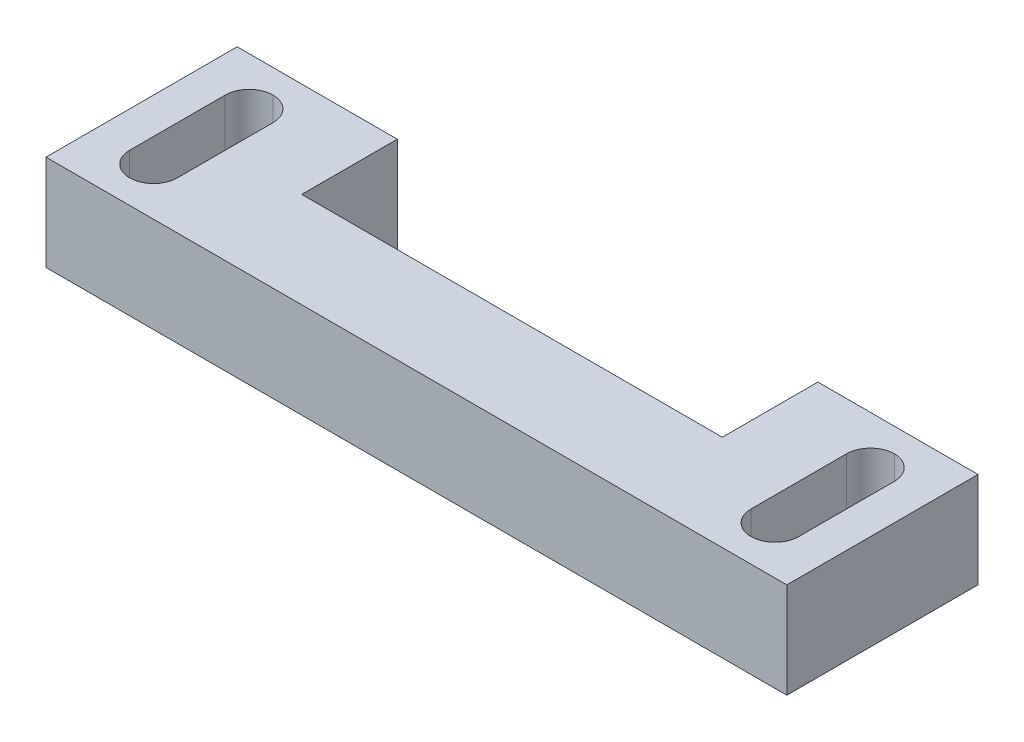
ISO-10303-21;
HEADER;
FILE_DESCRIPTION(('STEP AP214'),'2;1');
FILE_NAME('part.step','',(''),(''),'','','');
FILE_SCHEMA(('AUTOMOTIVE_DESIGN { 1 0 10303 214 1 1 1 1 }'));
ENDSEC;
DATA;
#1=APPLICATION_CONTEXT('core data for automotive mechanical design processes');
#2=APPLICATION_PROTOCOL_DEFINITION('international standard','automotive_design',2000,#1);
#3=PRODUCT_CONTEXT('',#1,'mechanical');
#4=PRODUCT('Part','Part','',(#3));
#5=PRODUCT_RELATED_PRODUCT_CATEGORY('part','',(#4));
#6=PRODUCT_DEFINITION_FORMATION('','',#4);
#7=PRODUCT_DEFINITION_CONTEXT('part definition',#1,'design');
#8=PRODUCT_DEFINITION('design','',#6,#7);
#9=PRODUCT_DEFINITION_SHAPE('','',#8);
#10=(LENGTH_UNIT() NAMED_UNIT(*) SI_UNIT(.MILLI.,.METRE.));
#11=(NAMED_UNIT(*) PLANE_ANGLE_UNIT() SI_UNIT($,.RADIAN.));
#12=(NAMED_UNIT(*) SI_UNIT($,.STERADIAN.) SOLID_ANGLE_UNIT());
#13=UNCERTAINTY_MEASURE_WITH_UNIT(LENGTH_MEASURE(1.E-05),#10,'distance_accuracy_value','');
#14=(GEOMETRIC_REPRESENTATION_CONTEXT(3) GLOBAL_UNCERTAINTY_ASSIGNED_CONTEXT((#13)) GLOBAL_UNIT_ASSIGNED_CONTEXT((#10,
#11,#12)) REPRESENTATION_CONTEXT('',''));
#15=CARTESIAN_POINT('',(0.,0.,0.));
#16=DIRECTION('',(0.,0.,1.));
#17=DIRECTION('',(1.,0.,0.));
#18=AXIS2_PLACEMENT_3D('',#15,#16,#17);
#19=CARTESIAN_POINT('',(0.,0.,-12.7));
#20=DIRECTION('',(0.,0.,1.));
#21=DIRECTION('',(1.,0.,0.));
#22=AXIS2_PLACEMENT_3D('',#19,#20,#21);
#23=PLANE('',#22);
#24=DIRECTION('',(-1.,0.,0.));
#25=VECTOR('',#24,1.);
#26=CARTESIAN_POINT('',(-49.2125,6.35,-12.7));
#27=LINE('',#26,#25);
#28=CARTESIAN_POINT('',(-27.94,6.35,-12.7));
#29=VERTEX_POINT('',#28);
#30=CARTESIAN_POINT('',(-49.2125,6.35,-12.7));
#31=VERTEX_POINT('',#30);
#32=EDGE_CURVE('E273',#29,#31,#27,.T.);
#33=ORIENTED_EDGE('',*,*,#32,.F.);
#34=DIRECTION('',(0.,1.,0.));
#35=VECTOR('',#34,1.);
#36=CARTESIAN_POINT('',(-27.94,-6.351,-12.7));
#37=LINE('',#36,#35);
#38=CARTESIAN_POINT('',(-27.94,-6.35,-12.7));
#39=VERTEX_POINT('',#38);
#40=EDGE_CURVE('E193',#39,#29,#37,.T.);
#41=ORIENTED_EDGE('',*,*,#40,.F.);
#42=DIRECTION('',(1.,0.,0.));
#43=VECTOR('',#42,1.);
#44=CARTESIAN_POINT('',(-49.2125,-6.35,-12.7));
#45=LINE('',#44,#43);
#46=CARTESIAN_POINT('',(-49.2125,-6.35,-12.7));
#47=VERTEX_POINT('',#46);
#48=EDGE_CURVE('E199',#47,#39,#45,.T.);
#49=ORIENTED_EDGE('',*,*,#48,.F.);
#50=DIRECTION('',(0.,-1.,0.));
#51=VECTOR('',#50,1.);
#52=CARTESIAN_POINT('',(-49.2125,6.35,-12.7));
#53=LINE('',#52,#51);
#54=EDGE_CURVE('E248',#31,#47,#53,.T.);
#55=ORIENTED_EDGE('',*,*,#54,.F.);
#56=EDGE_LOOP('',(#33,#41,#49,#55));
#57=FACE_BOUND('',#56,.T.);
#58=ADVANCED_FACE('F36',(#57),#23,.F.);
#59=CARTESIAN_POINT('',(41.275,-6.351,6.35));
#60=DIRECTION('',(0.,1.,0.));
#61=DIRECTION('',(0.,0.,1.));
#62=AXIS2_PLACEMENT_3D('',#59,#60,#61);
#63=CYLINDRICAL_SURFACE('',#62,3.175);
#64=DIRECTION('',(0.,-1.,0.));
#65=VECTOR('',#64,1.);
#66=CARTESIAN_POINT('',(38.1,-6.351,6.35));
#67=LINE('',#66,#65);
#68=CARTESIAN_POINT('',(38.1,6.35,6.35));
#69=VERTEX_POINT('',#68);
#70=CARTESIAN_POINT('',(38.1,-6.35,6.35));
#71=VERTEX_POINT('',#70);
#72=EDGE_CURVE('E382',#69,#71,#67,.T.);
#73=ORIENTED_EDGE('',*,*,#72,.F.);
#74=CARTESIAN_POINT('',(41.275,6.35,6.35));
#75=DIRECTION('',(0.,-1.,0.));
#76=DIRECTION('',(0.,0.,-1.));
#77=AXIS2_PLACEMENT_3D('',#74,#75,#76);
#78=CIRCLE('',#77,3.175);
#79=CARTESIAN_POINT('',(41.275,6.35,9.525));
#80=VERTEX_POINT('',#79);
#81=EDGE_CURVE('E45',#69,#80,#78,.F.);
#82=ORIENTED_EDGE('',*,*,#81,.T.);
#83=DIRECTION('',(0.,1.,0.));
#84=VECTOR('',#83,1.);
#85=CARTESIAN_POINT('',(41.275,-6.351,9.525));
#86=LINE('',#85,#84);
#87=CARTESIAN_POINT('',(41.275,-6.35,9.525));
#88=VERTEX_POINT('',#87);
#89=EDGE_CURVE('E371',#80,#88,#86,.F.);
#90=ORIENTED_EDGE('',*,*,#89,.T.);
#91=CARTESIAN_POINT('',(41.275,-6.35,6.35));
#92=DIRECTION('',(0.,1.,0.));
#93=DIRECTION('',(0.,0.,1.));
#94=AXIS2_PLACEMENT_3D('',#91,#92,#93);
#95=CIRCLE('',#94,3.175);
#96=EDGE_CURVE('E11',#88,#71,#95,.F.);
#97=ORIENTED_EDGE('',*,*,#96,.T.);
#98=EDGE_LOOP('',(#73,#82,#90,#97));
#99=FACE_BOUND('',#98,.T.);
#100=ADVANCED_FACE('F38',(#99),#63,.F.);
#101=CARTESIAN_POINT('',(41.275,-6.351,6.35));
#102=DIRECTION('',(0.,-1.,0.));
#103=DIRECTION('',(0.,0.,-1.));
#104=AXIS2_PLACEMENT_3D('',#101,#102,#103);
#105=CYLINDRICAL_SURFACE('',#104,3.175);
#106=DIRECTION('',(0.,1.,0.));
#107=VECTOR('',#106,1.);
#108=CARTESIAN_POINT('',(44.45,-6.351,6.35));
#109=LINE('',#108,#107);
#110=CARTESIAN_POINT('',(44.45,-6.35,6.35));
#111=VERTEX_POINT('',#110);
#112=CARTESIAN_POINT('',(44.45,6.35,6.35));
#113=VERTEX_POINT('',#112);
#114=EDGE_CURVE('E368',#111,#113,#109,.T.);
#115=ORIENTED_EDGE('',*,*,#114,.F.);
#116=CARTESIAN_POINT('',(41.275,-6.35,6.35));
#117=DIRECTION('',(0.,1.,0.));
#118=DIRECTION('',(0.,0.,1.));
#119=AXIS2_PLACEMENT_3D('',#116,#117,#118);
#120=CIRCLE('',#119,3.175);
#121=EDGE_CURVE('E375',#111,#88,#120,.F.);
#122=ORIENTED_EDGE('',*,*,#121,.T.);
#123=ORIENTED_EDGE('',*,*,#89,.F.);
#124=CARTESIAN_POINT('',(41.275,6.35,6.35));
#125=DIRECTION('',(0.,-1.,0.));
#126=DIRECTION('',(0.,0.,-1.));
#127=AXIS2_PLACEMENT_3D('',#124,#125,#126);
#128=CIRCLE('',#127,3.175);
#129=EDGE_CURVE('E379',#80,#113,#128,.F.);
#130=ORIENTED_EDGE('',*,*,#129,.T.);
#131=EDGE_LOOP('',(#115,#122,#123,#130));
#132=FACE_BOUND('',#131,.T.);
#133=ADVANCED_FACE('F394',(#132),#105,.F.);
#134=CARTESIAN_POINT('',(41.275,-6.351,-6.35));
#135=DIRECTION('',(0.,1.,0.));
#136=DIRECTION('',(0.,0.,1.));
#137=AXIS2_PLACEMENT_3D('',#134,#135,#136);
#138=CYLINDRICAL_SURFACE('',#137,3.175);
#139=DIRECTION('',(0.,-1.,0.));
#140=VECTOR('',#139,1.);
#141=CARTESIAN_POINT('',(38.1,-6.351,-6.35));
#142=LINE('',#141,#140);
#143=CARTESIAN_POINT('',(38.1,-6.35,-6.35));
#144=VERTEX_POINT('',#143);
#145=CARTESIAN_POINT('',(38.1,6.35,-6.35));
#146=VERTEX_POINT('',#145);
#147=EDGE_CURVE('E357',#144,#146,#142,.F.);
#148=ORIENTED_EDGE('',*,*,#147,.F.);
#149=CARTESIAN_POINT('',(41.275,-6.35,-6.35));
#150=DIRECTION('',(0.,1.,0.));
#151=DIRECTION('',(0.,0.,1.));
#152=AXIS2_PLACEMENT_3D('',#149,#150,#151);
#153=CIRCLE('',#152,3.175);
#154=CARTESIAN_POINT('',(41.275,-6.35,-9.525));
#155=VERTEX_POINT('',#154);
#156=EDGE_CURVE('E365',#144,#155,#153,.F.);
#157=ORIENTED_EDGE('',*,*,#156,.T.);
#158=DIRECTION('',(0.,-1.,0.));
#159=VECTOR('',#158,1.);
#160=CARTESIAN_POINT('',(41.275,-6.351,-9.525));
#161=LINE('',#160,#159);
#162=CARTESIAN_POINT('',(41.275,6.35,-9.525));
#163=VERTEX_POINT('',#162);
#164=EDGE_CURVE('E345',#155,#163,#161,.F.);
#165=ORIENTED_EDGE('',*,*,#164,.T.);
#166=CARTESIAN_POINT('',(41.275,6.35,-6.35));
#167=DIRECTION('',(0.,-1.,0.));
#168=DIRECTION('',(0.,0.,-1.));
#169=AXIS2_PLACEMENT_3D('',#166,#167,#168);
#170=CIRCLE('',#169,3.175);
#171=EDGE_CURVE('E361',#163,#146,#170,.F.);
#172=ORIENTED_EDGE('',*,*,#171,.T.);
#173=EDGE_LOOP('',(#148,#157,#165,#172));
#174=FACE_BOUND('',#173,.T.);
#175=ADVANCED_FACE('F403',(#174),#138,.F.);
#176=CARTESIAN_POINT('',(41.275,-6.351,-6.35));
#177=DIRECTION('',(0.,1.,0.));
#178=DIRECTION('',(0.,0.,1.));
#179=AXIS2_PLACEMENT_3D('',#176,#177,#178);
#180=CYLINDRICAL_SURFACE('',#179,3.175);
#181=DIRECTION('',(0.,-1.,0.));
#182=VECTOR('',#181,1.);
#183=CARTESIAN_POINT('',(44.45,-6.351,-6.35));
#184=LINE('',#183,#182);
#185=CARTESIAN_POINT('',(44.45,6.35,-6.35));
#186=VERTEX_POINT('',#185);
#187=CARTESIAN_POINT('',(44.45,-6.35,-6.35));
#188=VERTEX_POINT('',#187);
#189=EDGE_CURVE('E341',#186,#188,#184,.T.);
#190=ORIENTED_EDGE('',*,*,#189,.F.);
#191=CARTESIAN_POINT('',(41.275,6.35,-6.35));
#192=DIRECTION('',(0.,-1.,0.));
#193=DIRECTION('',(0.,0.,-1.));
#194=AXIS2_PLACEMENT_3D('',#191,#192,#193);
#195=CIRCLE('',#194,3.175);
#196=EDGE_CURVE('E349',#186,#163,#195,.F.);
#197=ORIENTED_EDGE('',*,*,#196,.T.);
#198=ORIENTED_EDGE('',*,*,#164,.F.);
#199=CARTESIAN_POINT('',(41.275,-6.35,-6.35));
#200=DIRECTION('',(0.,1.,0.));
#201=DIRECTION('',(0.,0.,1.));
#202=AXIS2_PLACEMENT_3D('',#199,#200,#201);
#203=CIRCLE('',#202,3.175);
#204=EDGE_CURVE('E353',#155,#188,#203,.F.);
#205=ORIENTED_EDGE('',*,*,#204,.T.);
#206=EDGE_LOOP('',(#190,#197,#198,#205));
#207=FACE_BOUND('',#206,.T.);
#208=ADVANCED_FACE('F407',(#207),#180,.F.);
#209=CARTESIAN_POINT('',(-49.2125,-6.35,12.7));
#210=DIRECTION('',(0.,1.,0.));
#211=DIRECTION('',(0.,0.,1.));
#212=AXIS2_PLACEMENT_3D('',#209,#210,#211);
#213=PLANE('',#212);
#214=ORIENTED_EDGE('',*,*,#48,.T.);
#215=DIRECTION('',(0.,0.,-1.));
#216=VECTOR('',#215,1.);
#217=CARTESIAN_POINT('',(-27.94,-6.35,-12.7));
#218=LINE('',#217,#216);
#219=CARTESIAN_POINT('',(-27.94,-6.35,0.));
#220=VERTEX_POINT('',#219);
#221=EDGE_CURVE('E175',#220,#39,#218,.T.);
#222=ORIENTED_EDGE('',*,*,#221,.F.);
#223=DIRECTION('',(-1.,0.,0.));
#224=VECTOR('',#223,1.);
#225=CARTESIAN_POINT('',(-27.94,-6.35,0.));
#226=LINE('',#225,#224);
#227=CARTESIAN_POINT('',(27.94,-6.35,0.));
#228=VERTEX_POINT('',#227);
#229=EDGE_CURVE('E186',#228,#220,#226,.T.);
#230=ORIENTED_EDGE('',*,*,#229,.F.);
#231=DIRECTION('',(0.,0.,1.));
#232=VECTOR('',#231,1.);
#233=CARTESIAN_POINT('',(27.94,-6.35,-12.7));
#234=LINE('',#233,#232);
#235=CARTESIAN_POINT('',(27.94,-6.35,-12.7));
#236=VERTEX_POINT('',#235);
#237=EDGE_CURVE('E201',#236,#228,#234,.T.);
#238=ORIENTED_EDGE('',*,*,#237,.F.);
#239=CARTESIAN_POINT('',(49.2125,-6.35,-12.7));
#240=VERTEX_POINT('',#239);
#241=EDGE_CURVE('E267',#236,#240,#45,.T.);
#242=ORIENTED_EDGE('',*,*,#241,.T.);
#243=DIRECTION('',(0.,0.,-1.));
#244=VECTOR('',#243,1.);
#245=CARTESIAN_POINT('',(49.2125,-6.35,12.7));
#246=LINE('',#245,#244);
#247=CARTESIAN_POINT('',(49.2125,-6.35,12.7));
#248=VERTEX_POINT('',#247);
#249=EDGE_CURVE('E284',#248,#240,#246,.T.);
#250=ORIENTED_EDGE('',*,*,#249,.F.);
#251=DIRECTION('',(1.,0.,0.));
#252=VECTOR('',#251,1.);
#253=CARTESIAN_POINT('',(-49.2125,-6.35,12.7));
#254=LINE('',#253,#252);
#255=CARTESIAN_POINT('',(-49.2125,-6.35,12.7));
#256=VERTEX_POINT('',#255);
#257=EDGE_CURVE('E253',#256,#248,#254,.T.);
#258=ORIENTED_EDGE('',*,*,#257,.F.);
#259=DIRECTION('',(0.,0.,-1.));
#260=VECTOR('',#259,1.);
#261=CARTESIAN_POINT('',(-49.2125,-6.35,12.7));
#262=LINE('',#261,#260);
#263=EDGE_CURVE('E288',#256,#47,#262,.T.);
#264=ORIENTED_EDGE('',*,*,#263,.T.);
#265=EDGE_LOOP('',(#214,#222,#230,#238,#242,#250,#258,#264));
#266=FACE_BOUND('',#265,.T.);
#267=ORIENTED_EDGE('',*,*,#96,.F.);
#268=ORIENTED_EDGE('',*,*,#121,.F.);
#269=DIRECTION('',(0.,0.,-1.));
#270=VECTOR('',#269,1.);
#271=CARTESIAN_POINT('',(44.45,-6.35,-9.525));
#272=LINE('',#271,#270);
#273=EDGE_CURVE('E225',#111,#188,#272,.T.);
#274=ORIENTED_EDGE('',*,*,#273,.T.);
#275=ORIENTED_EDGE('',*,*,#204,.F.);
#276=ORIENTED_EDGE('',*,*,#156,.F.);
#277=DIRECTION('',(0.,0.,1.));
#278=VECTOR('',#277,1.);
#279=CARTESIAN_POINT('',(38.1,-6.35,-9.525));
#280=LINE('',#279,#278);
#281=EDGE_CURVE('E192',#144,#71,#280,.T.);
#282=ORIENTED_EDGE('',*,*,#281,.T.);
#283=EDGE_LOOP('',(#267,#268,#274,#275,#276,#282));
#284=FACE_BOUND('',#283,.T.);
#285=CARTESIAN_POINT('',(-41.275,-6.35,-6.35));
#286=DIRECTION('',(0.,1.,0.));
#287=DIRECTION('',(0.,0.,1.));
#288=AXIS2_PLACEMENT_3D('',#285,#286,#287);
#289=CIRCLE('',#288,3.175);
#290=CARTESIAN_POINT('',(-41.275,-6.35,-9.525));
#291=VERTEX_POINT('',#290);
#292=CARTESIAN_POINT('',(-38.1,-6.35,-6.35));
#293=VERTEX_POINT('',#292);
#294=EDGE_CURVE('E310',#291,#293,#289,.F.);
#295=ORIENTED_EDGE('',*,*,#294,.F.);
#296=CARTESIAN_POINT('',(-41.275,-6.35,-6.35));
#297=DIRECTION('',(0.,1.,0.));
#298=DIRECTION('',(0.,0.,1.));
#299=AXIS2_PLACEMENT_3D('',#296,#297,#298);
#300=CIRCLE('',#299,3.175);
#301=CARTESIAN_POINT('',(-44.45,-6.35,-6.35));
#302=VERTEX_POINT('',#301);
#303=EDGE_CURVE('E299',#302,#291,#300,.F.);
#304=ORIENTED_EDGE('',*,*,#303,.F.);
#305=DIRECTION('',(0.,0.,-1.));
#306=VECTOR('',#305,1.);
#307=CARTESIAN_POINT('',(-44.45,-6.35,-9.525));
#308=LINE('',#307,#306);
#309=CARTESIAN_POINT('',(-44.45,-6.35,6.35));
#310=VERTEX_POINT('',#309);
#311=EDGE_CURVE('E238',#310,#302,#308,.T.);
#312=ORIENTED_EDGE('',*,*,#311,.F.);
#313=CARTESIAN_POINT('',(-41.275,-6.35,6.35));
#314=DIRECTION('',(0.,1.,0.));
#315=DIRECTION('',(0.,0.,1.));
#316=AXIS2_PLACEMENT_3D('',#313,#314,#315);
#317=CIRCLE('',#316,3.175);
#318=CARTESIAN_POINT('',(-41.275,-6.35,9.525));
#319=VERTEX_POINT('',#318);
#320=EDGE_CURVE('E328',#319,#310,#317,.F.);
#321=ORIENTED_EDGE('',*,*,#320,.F.);
#322=CARTESIAN_POINT('',(-41.275,-6.35,6.35));
#323=DIRECTION('',(0.,1.,0.));
#324=DIRECTION('',(0.,0.,1.));
#325=AXIS2_PLACEMENT_3D('',#322,#323,#324);
#326=CIRCLE('',#325,3.175);
#327=CARTESIAN_POINT('',(-38.1,-6.35,6.35));
#328=VERTEX_POINT('',#327);
#329=EDGE_CURVE('E335',#328,#319,#326,.F.);
#330=ORIENTED_EDGE('',*,*,#329,.F.);
#331=DIRECTION('',(0.,0.,1.));
#332=VECTOR('',#331,1.);
#333=CARTESIAN_POINT('',(-38.1,-6.35,-9.525));
#334=LINE('',#333,#332);
#335=EDGE_CURVE('E234',#293,#328,#334,.T.);
#336=ORIENTED_EDGE('',*,*,#335,.F.);
#337=EDGE_LOOP('',(#295,#304,#312,#321,#330,#336));
#338=FACE_BOUND('',#337,.T.);
#339=ADVANCED_FACE('F196',(#266,#284,#338),#213,.F.);
#340=CARTESIAN_POINT('',(-49.2125,6.35,12.7));
#341=DIRECTION('',(0.,-1.,0.));
#342=DIRECTION('',(0.,0.,-1.));
#343=AXIS2_PLACEMENT_3D('',#340,#341,#342);
#344=PLANE('',#343);
#345=ORIENTED_EDGE('',*,*,#81,.F.);
#346=DIRECTION('',(0.,0.,-1.));
#347=VECTOR('',#346,1.);
#348=CARTESIAN_POINT('',(38.1,6.35,-9.525));
#349=LINE('',#348,#347);
#350=EDGE_CURVE('E231',#69,#146,#349,.T.);
#351=ORIENTED_EDGE('',*,*,#350,.T.);
#352=ORIENTED_EDGE('',*,*,#171,.F.);
#353=ORIENTED_EDGE('',*,*,#196,.F.);
#354=DIRECTION('',(0.,0.,1.));
#355=VECTOR('',#354,1.);
#356=CARTESIAN_POINT('',(44.45,6.35,-9.525));
#357=LINE('',#356,#355);
#358=EDGE_CURVE('E227',#186,#113,#357,.T.);
#359=ORIENTED_EDGE('',*,*,#358,.T.);
#360=ORIENTED_EDGE('',*,*,#129,.F.);
#361=EDGE_LOOP('',(#345,#351,#352,#353,#359,#360));
#362=FACE_BOUND('',#361,.T.);
#363=DIRECTION('',(1.,0.,0.));
#364=VECTOR('',#363,1.);
#365=CARTESIAN_POINT('',(-27.94,6.35,0.));
#366=LINE('',#365,#364);
#367=CARTESIAN_POINT('',(-27.94,6.35,0.));
#368=VERTEX_POINT('',#367);
#369=CARTESIAN_POINT('',(27.94,6.35,0.));
#370=VERTEX_POINT('',#369);
#371=EDGE_CURVE('E206',#368,#370,#366,.T.);
#372=ORIENTED_EDGE('',*,*,#371,.F.);
#373=DIRECTION('',(0.,0.,1.));
#374=VECTOR('',#373,1.);
#375=CARTESIAN_POINT('',(-27.94,6.35,-12.7));
#376=LINE('',#375,#374);
#377=EDGE_CURVE('E178',#29,#368,#376,.T.);
#378=ORIENTED_EDGE('',*,*,#377,.F.);
#379=ORIENTED_EDGE('',*,*,#32,.T.);
#380=DIRECTION('',(0.,0.,-1.));
#381=VECTOR('',#380,1.);
#382=CARTESIAN_POINT('',(-49.2125,6.35,12.7));
#383=LINE('',#382,#381);
#384=CARTESIAN_POINT('',(-49.2125,6.35,12.7));
#385=VERTEX_POINT('',#384);
#386=EDGE_CURVE('E263',#385,#31,#383,.T.);
#387=ORIENTED_EDGE('',*,*,#386,.F.);
#388=DIRECTION('',(-1.,0.,0.));
#389=VECTOR('',#388,1.);
#390=CARTESIAN_POINT('',(-49.2125,6.35,12.7));
#391=LINE('',#390,#389);
#392=CARTESIAN_POINT('',(49.2125,6.35,12.7));
#393=VERTEX_POINT('',#392);
#394=EDGE_CURVE('E260',#393,#385,#391,.T.);
#395=ORIENTED_EDGE('',*,*,#394,.F.);
#396=DIRECTION('',(0.,0.,-1.));
#397=VECTOR('',#396,1.);
#398=CARTESIAN_POINT('',(49.2125,6.35,12.7));
#399=LINE('',#398,#397);
#400=CARTESIAN_POINT('',(49.2125,6.35,-12.7));
#401=VERTEX_POINT('',#400);
#402=EDGE_CURVE('E280',#393,#401,#399,.T.);
#403=ORIENTED_EDGE('',*,*,#402,.T.);
#404=CARTESIAN_POINT('',(27.94,6.35,-12.7));
#405=VERTEX_POINT('',#404);
#406=EDGE_CURVE('E254',#401,#405,#27,.T.);
#407=ORIENTED_EDGE('',*,*,#406,.T.);
#408=DIRECTION('',(0.,0.,-1.));
#409=VECTOR('',#408,1.);
#410=CARTESIAN_POINT('',(27.94,6.35,-12.7));
#411=LINE('',#410,#409);
#412=EDGE_CURVE('E52',#370,#405,#411,.T.);
#413=ORIENTED_EDGE('',*,*,#412,.F.);
#414=EDGE_LOOP('',(#372,#378,#379,#387,#395,#403,#407,#413));
#415=FACE_BOUND('',#414,.T.);
#416=CARTESIAN_POINT('',(-41.275,6.35,6.35));
#417=DIRECTION('',(0.,-1.,0.));
#418=DIRECTION('',(0.,0.,-1.));
#419=AXIS2_PLACEMENT_3D('',#416,#417,#418);
#420=CIRCLE('',#419,3.175);
#421=CARTESIAN_POINT('',(-41.275,6.35,9.525));
#422=VERTEX_POINT('',#421);
#423=CARTESIAN_POINT('',(-38.1,6.35,6.35));
#424=VERTEX_POINT('',#423);
#425=EDGE_CURVE('E338',#422,#424,#420,.F.);
#426=ORIENTED_EDGE('',*,*,#425,.F.);
#427=CARTESIAN_POINT('',(-41.275,6.35,6.35));
#428=DIRECTION('',(0.,-1.,0.));
#429=DIRECTION('',(0.,0.,-1.));
#430=AXIS2_PLACEMENT_3D('',#427,#428,#429);
#431=CIRCLE('',#430,3.175);
#432=CARTESIAN_POINT('',(-44.45,6.35,6.35));
#433=VERTEX_POINT('',#432);
#434=EDGE_CURVE('E324',#433,#422,#431,.F.);
#435=ORIENTED_EDGE('',*,*,#434,.F.);
#436=DIRECTION('',(0.,0.,1.));
#437=VECTOR('',#436,1.);
#438=CARTESIAN_POINT('',(-44.45,6.35,-9.525));
#439=LINE('',#438,#437);
#440=CARTESIAN_POINT('',(-44.45,6.35,-6.35));
#441=VERTEX_POINT('',#440);
#442=EDGE_CURVE('E241',#441,#433,#439,.T.);
#443=ORIENTED_EDGE('',*,*,#442,.F.);
#444=CARTESIAN_POINT('',(-41.275,6.35,-6.35));
#445=DIRECTION('',(0.,-1.,0.));
#446=DIRECTION('',(0.,0.,-1.));
#447=AXIS2_PLACEMENT_3D('',#444,#445,#446);
#448=CIRCLE('',#447,3.175);
#449=CARTESIAN_POINT('',(-41.275,6.35,-9.525));
#450=VERTEX_POINT('',#449);
#451=EDGE_CURVE('E303',#450,#441,#448,.F.);
#452=ORIENTED_EDGE('',*,*,#451,.F.);
#453=CARTESIAN_POINT('',(-41.275,6.35,-6.35));
#454=DIRECTION('',(0.,-1.,0.));
#455=DIRECTION('',(0.,0.,-1.));
#456=AXIS2_PLACEMENT_3D('',#453,#454,#455);
#457=CIRCLE('',#456,3.175);
#458=CARTESIAN_POINT('',(-38.1,6.35,-6.35));
#459=VERTEX_POINT('',#458);
#460=EDGE_CURVE('E313',#459,#450,#457,.F.);
#461=ORIENTED_EDGE('',*,*,#460,.F.);
#462=DIRECTION('',(0.,0.,-1.));
#463=VECTOR('',#462,1.);
#464=CARTESIAN_POINT('',(-38.1,6.35,-9.525));
#465=LINE('',#464,#463);
#466=EDGE_CURVE('E245',#424,#459,#465,.T.);
#467=ORIENTED_EDGE('',*,*,#466,.F.);
#468=EDGE_LOOP('',(#426,#435,#443,#452,#461,#467));
#469=FACE_BOUND('',#468,.T.);
#470=ADVANCED_FACE('F389',(#362,#415,#469),#344,.F.);
#471=CARTESIAN_POINT('',(-41.275,-6.351,6.35));
#472=DIRECTION('',(0.,-1.,0.));
#473=DIRECTION('',(0.,0.,-1.));
#474=AXIS2_PLACEMENT_3D('',#471,#472,#473);
#475=CYLINDRICAL_SURFACE('',#474,3.175);
#476=DIRECTION('',(0.,1.,0.));
#477=VECTOR('',#476,1.);
#478=CARTESIAN_POINT('',(-38.1,-6.351,6.35));
#479=LINE('',#478,#477);
#480=EDGE_CURVE('E331',#328,#424,#479,.T.);
#481=ORIENTED_EDGE('',*,*,#480,.F.);
#482=ORIENTED_EDGE('',*,*,#329,.T.);
#483=DIRECTION('',(0.,-1.,0.));
#484=VECTOR('',#483,1.);
#485=CARTESIAN_POINT('',(-41.275,-6.351,9.525));
#486=LINE('',#485,#484);
#487=EDGE_CURVE('E320',#319,#422,#486,.F.);
#488=ORIENTED_EDGE('',*,*,#487,.T.);
#489=ORIENTED_EDGE('',*,*,#425,.T.);
#490=EDGE_LOOP('',(#481,#482,#488,#489));
#491=FACE_BOUND('',#490,.T.);
#492=ADVANCED_FACE('F460',(#491),#475,.F.);
#493=CARTESIAN_POINT('',(-41.275,-6.351,6.35));
#494=DIRECTION('',(0.,1.,0.));
#495=DIRECTION('',(0.,0.,1.));
#496=AXIS2_PLACEMENT_3D('',#493,#494,#495);
#497=CYLINDRICAL_SURFACE('',#496,3.175);
#498=DIRECTION('',(0.,-1.,0.));
#499=VECTOR('',#498,1.);
#500=CARTESIAN_POINT('',(-44.45,-6.351,6.35));
#501=LINE('',#500,#499);
#502=EDGE_CURVE('E316',#433,#310,#501,.T.);
#503=ORIENTED_EDGE('',*,*,#502,.F.);
#504=ORIENTED_EDGE('',*,*,#434,.T.);
#505=ORIENTED_EDGE('',*,*,#487,.F.);
#506=ORIENTED_EDGE('',*,*,#320,.T.);
#507=EDGE_LOOP('',(#503,#504,#505,#506));
#508=FACE_BOUND('',#507,.T.);
#509=ADVANCED_FACE('F469',(#508),#497,.F.);
#510=CARTESIAN_POINT('',(-41.275,-6.351,-6.35));
#511=DIRECTION('',(0.,-1.,0.));
#512=DIRECTION('',(0.,0.,-1.));
#513=AXIS2_PLACEMENT_3D('',#510,#511,#512);
#514=CYLINDRICAL_SURFACE('',#513,3.175);
#515=DIRECTION('',(0.,1.,0.));
#516=VECTOR('',#515,1.);
#517=CARTESIAN_POINT('',(-38.1,-6.351,-6.35));
#518=LINE('',#517,#516);
#519=EDGE_CURVE('E306',#459,#293,#518,.F.);
#520=ORIENTED_EDGE('',*,*,#519,.F.);
#521=ORIENTED_EDGE('',*,*,#460,.T.);
#522=DIRECTION('',(0.,1.,0.));
#523=VECTOR('',#522,1.);
#524=CARTESIAN_POINT('',(-41.275,-6.351,-9.525));
#525=LINE('',#524,#523);
#526=EDGE_CURVE('E295',#450,#291,#525,.F.);
#527=ORIENTED_EDGE('',*,*,#526,.T.);
#528=ORIENTED_EDGE('',*,*,#294,.T.);
#529=EDGE_LOOP('',(#520,#521,#527,#528));
#530=FACE_BOUND('',#529,.T.);
#531=ADVANCED_FACE('F481',(#530),#514,.F.);
#532=CARTESIAN_POINT('',(-41.275,-6.351,-6.35));
#533=DIRECTION('',(0.,-1.,0.));
#534=DIRECTION('',(0.,0.,-1.));
#535=AXIS2_PLACEMENT_3D('',#532,#533,#534);
#536=CYLINDRICAL_SURFACE('',#535,3.175);
#537=DIRECTION('',(0.,1.,0.));
#538=VECTOR('',#537,1.);
#539=CARTESIAN_POINT('',(-44.45,-6.351,-6.35));
#540=LINE('',#539,#538);
#541=EDGE_CURVE('E291',#302,#441,#540,.T.);
#542=ORIENTED_EDGE('',*,*,#541,.F.);
#543=ORIENTED_EDGE('',*,*,#303,.T.);
#544=ORIENTED_EDGE('',*,*,#526,.F.);
#545=ORIENTED_EDGE('',*,*,#451,.T.);
#546=EDGE_LOOP('',(#542,#543,#544,#545));
#547=FACE_BOUND('',#546,.T.);
#548=ADVANCED_FACE('F479',(#547),#536,.F.);
#549=CARTESIAN_POINT('',(-49.2125,6.35,12.7));
#550=DIRECTION('',(1.,0.,0.));
#551=DIRECTION('',(0.,0.,-1.));
#552=AXIS2_PLACEMENT_3D('',#549,#550,#551);
#553=PLANE('',#552);
#554=ORIENTED_EDGE('',*,*,#54,.T.);
#555=ORIENTED_EDGE('',*,*,#263,.F.);
#556=DIRECTION('',(0.,-1.,0.));
#557=VECTOR('',#556,1.);
#558=CARTESIAN_POINT('',(-49.2125,6.35,12.7));
#559=LINE('',#558,#557);
#560=EDGE_CURVE('E249',#385,#256,#559,.T.);
#561=ORIENTED_EDGE('',*,*,#560,.F.);
#562=ORIENTED_EDGE('',*,*,#386,.T.);
#563=EDGE_LOOP('',(#554,#555,#561,#562));
#564=FACE_BOUND('',#563,.T.);
#565=ADVANCED_FACE('F456',(#564),#553,.F.);
#566=CARTESIAN_POINT('',(49.2125,6.35,12.7));
#567=DIRECTION('',(-1.,0.,0.));
#568=DIRECTION('',(0.,0.,1.));
#569=AXIS2_PLACEMENT_3D('',#566,#567,#568);
#570=PLANE('',#569);
#571=DIRECTION('',(0.,1.,0.));
#572=VECTOR('',#571,1.);
#573=CARTESIAN_POINT('',(49.2125,6.35,-12.7));
#574=LINE('',#573,#572);
#575=EDGE_CURVE('E270',#240,#401,#574,.T.);
#576=ORIENTED_EDGE('',*,*,#575,.T.);
#577=ORIENTED_EDGE('',*,*,#402,.F.);
#578=DIRECTION('',(0.,1.,0.));
#579=VECTOR('',#578,1.);
#580=CARTESIAN_POINT('',(49.2125,6.35,12.7));
#581=LINE('',#580,#579);
#582=EDGE_CURVE('E257',#248,#393,#581,.T.);
#583=ORIENTED_EDGE('',*,*,#582,.F.);
#584=ORIENTED_EDGE('',*,*,#249,.T.);
#585=EDGE_LOOP('',(#576,#577,#583,#584));
#586=FACE_BOUND('',#585,.T.);
#587=ADVANCED_FACE('F440',(#586),#570,.F.);
#588=CARTESIAN_POINT('',(0.,0.,12.7));
#589=DIRECTION('',(0.,0.,1.));
#590=DIRECTION('',(1.,0.,0.));
#591=AXIS2_PLACEMENT_3D('',#588,#589,#590);
#592=PLANE('',#591);
#593=ORIENTED_EDGE('',*,*,#560,.T.);
#594=ORIENTED_EDGE('',*,*,#257,.T.);
#595=ORIENTED_EDGE('',*,*,#582,.T.);
#596=ORIENTED_EDGE('',*,*,#394,.T.);
#597=EDGE_LOOP('',(#593,#594,#595,#596));
#598=FACE_BOUND('',#597,.T.);
#599=ADVANCED_FACE('F432',(#598),#592,.T.);
#600=ORIENTED_EDGE('',*,*,#241,.F.);
#601=DIRECTION('',(0.,1.,0.));
#602=VECTOR('',#601,1.);
#603=CARTESIAN_POINT('',(27.94,-6.351,-12.7));
#604=LINE('',#603,#602);
#605=EDGE_CURVE('E217',#236,#405,#604,.T.);
#606=ORIENTED_EDGE('',*,*,#605,.T.);
#607=ORIENTED_EDGE('',*,*,#406,.F.);
#608=ORIENTED_EDGE('',*,*,#575,.F.);
#609=EDGE_LOOP('',(#600,#606,#607,#608));
#610=FACE_BOUND('',#609,.T.);
#611=ADVANCED_FACE('F424',(#610),#23,.F.);
#612=CARTESIAN_POINT('',(-44.45,-6.351,-9.525));
#613=DIRECTION('',(-1.,0.,0.));
#614=DIRECTION('',(0.,0.,1.));
#615=AXIS2_PLACEMENT_3D('',#612,#613,#614);
#616=PLANE('',#615);
#617=ORIENTED_EDGE('',*,*,#442,.T.);
#618=ORIENTED_EDGE('',*,*,#502,.T.);
#619=ORIENTED_EDGE('',*,*,#311,.T.);
#620=ORIENTED_EDGE('',*,*,#541,.T.);
#621=EDGE_LOOP('',(#617,#618,#619,#620));
#622=FACE_BOUND('',#621,.T.);
#623=ADVANCED_FACE('F418',(#622),#616,.F.);
#624=CARTESIAN_POINT('',(-38.1,-6.351,-9.525));
#625=DIRECTION('',(1.,0.,0.));
#626=DIRECTION('',(0.,0.,-1.));
#627=AXIS2_PLACEMENT_3D('',#624,#625,#626);
#628=PLANE('',#627);
#629=ORIENTED_EDGE('',*,*,#335,.T.);
#630=ORIENTED_EDGE('',*,*,#480,.T.);
#631=ORIENTED_EDGE('',*,*,#466,.T.);
#632=ORIENTED_EDGE('',*,*,#519,.T.);
#633=EDGE_LOOP('',(#629,#630,#631,#632));
#634=FACE_BOUND('',#633,.T.);
#635=ADVANCED_FACE('F411',(#634),#628,.F.);
#636=CARTESIAN_POINT('',(44.45,-6.351,-9.525));
#637=DIRECTION('',(-1.,0.,0.));
#638=DIRECTION('',(0.,0.,1.));
#639=AXIS2_PLACEMENT_3D('',#636,#637,#638);
#640=PLANE('',#639);
#641=ORIENTED_EDGE('',*,*,#273,.F.);
#642=ORIENTED_EDGE('',*,*,#114,.T.);
#643=ORIENTED_EDGE('',*,*,#358,.F.);
#644=ORIENTED_EDGE('',*,*,#189,.T.);
#645=EDGE_LOOP('',(#641,#642,#643,#644));
#646=FACE_BOUND('',#645,.T.);
#647=ADVANCED_FACE('F409',(#646),#640,.T.);
#648=CARTESIAN_POINT('',(38.1,-6.351,-9.525));
#649=DIRECTION('',(1.,0.,0.));
#650=DIRECTION('',(0.,0.,-1.));
#651=AXIS2_PLACEMENT_3D('',#648,#649,#650);
#652=PLANE('',#651);
#653=ORIENTED_EDGE('',*,*,#350,.F.);
#654=ORIENTED_EDGE('',*,*,#72,.T.);
#655=ORIENTED_EDGE('',*,*,#281,.F.);
#656=ORIENTED_EDGE('',*,*,#147,.T.);
#657=EDGE_LOOP('',(#653,#654,#655,#656));
#658=FACE_BOUND('',#657,.T.);
#659=ADVANCED_FACE('F400',(#658),#652,.T.);
#660=CARTESIAN_POINT('',(-27.94,-6.351,-12.7));
#661=DIRECTION('',(-1.,0.,0.));
#662=DIRECTION('',(0.,0.,1.));
#663=AXIS2_PLACEMENT_3D('',#660,#661,#662);
#664=PLANE('',#663);
#665=ORIENTED_EDGE('',*,*,#221,.T.);
#666=ORIENTED_EDGE('',*,*,#40,.T.);
#667=ORIENTED_EDGE('',*,*,#377,.T.);
#668=DIRECTION('',(0.,1.,0.));
#669=VECTOR('',#668,1.);
#670=CARTESIAN_POINT('',(-27.94,-6.351,0.));
#671=LINE('',#670,#669);
#672=EDGE_CURVE('E171',#220,#368,#671,.T.);
#673=ORIENTED_EDGE('',*,*,#672,.F.);
#674=EDGE_LOOP('',(#665,#666,#667,#673));
#675=FACE_BOUND('',#674,.T.);
#676=ADVANCED_FACE('F173',(#675),#664,.F.);
#677=CARTESIAN_POINT('',(27.94,-6.351,-12.7));
#678=DIRECTION('',(1.,0.,0.));
#679=DIRECTION('',(0.,0.,-1.));
#680=AXIS2_PLACEMENT_3D('',#677,#678,#679);
#681=PLANE('',#680);
#682=ORIENTED_EDGE('',*,*,#237,.T.);
#683=DIRECTION('',(0.,1.,0.));
#684=VECTOR('',#683,1.);
#685=CARTESIAN_POINT('',(27.94,-6.351,0.));
#686=LINE('',#685,#684);
#687=EDGE_CURVE('E183',#228,#370,#686,.T.);
#688=ORIENTED_EDGE('',*,*,#687,.T.);
#689=ORIENTED_EDGE('',*,*,#412,.T.);
#690=ORIENTED_EDGE('',*,*,#605,.F.);
#691=EDGE_LOOP('',(#682,#688,#689,#690));
#692=FACE_BOUND('',#691,.T.);
#693=ADVANCED_FACE('F578',(#692),#681,.F.);
#694=CARTESIAN_POINT('',(-27.94,-6.351,0.));
#695=DIRECTION('',(0.,0.,1.));
#696=DIRECTION('',(1.,0.,0.));
#697=AXIS2_PLACEMENT_3D('',#694,#695,#696);
#698=PLANE('',#697);
#699=ORIENTED_EDGE('',*,*,#229,.T.);
#700=ORIENTED_EDGE('',*,*,#672,.T.);
#701=ORIENTED_EDGE('',*,*,#371,.T.);
#702=ORIENTED_EDGE('',*,*,#687,.F.);
#703=EDGE_LOOP('',(#699,#700,#701,#702));
#704=FACE_BOUND('',#703,.T.);
#705=ADVANCED_FACE('F187',(#704),#698,.F.);
#706=CLOSED_SHELL('',(#58,#100,#133,#175,#208,#339,#470,#492,#509,#531,#548,#565,#587,#599,#611,
#623,#635,#647,#659,#676,#693,#705));
#707=MANIFOLD_SOLID_BREP('B2',#706);
#708=ADVANCED_BREP_SHAPE_REPRESENTATION('',(#18,#707),#14);
#709=SHAPE_DEFINITION_REPRESENTATION(#9,#708);
ENDSEC;
END-ISO-10303-21;
